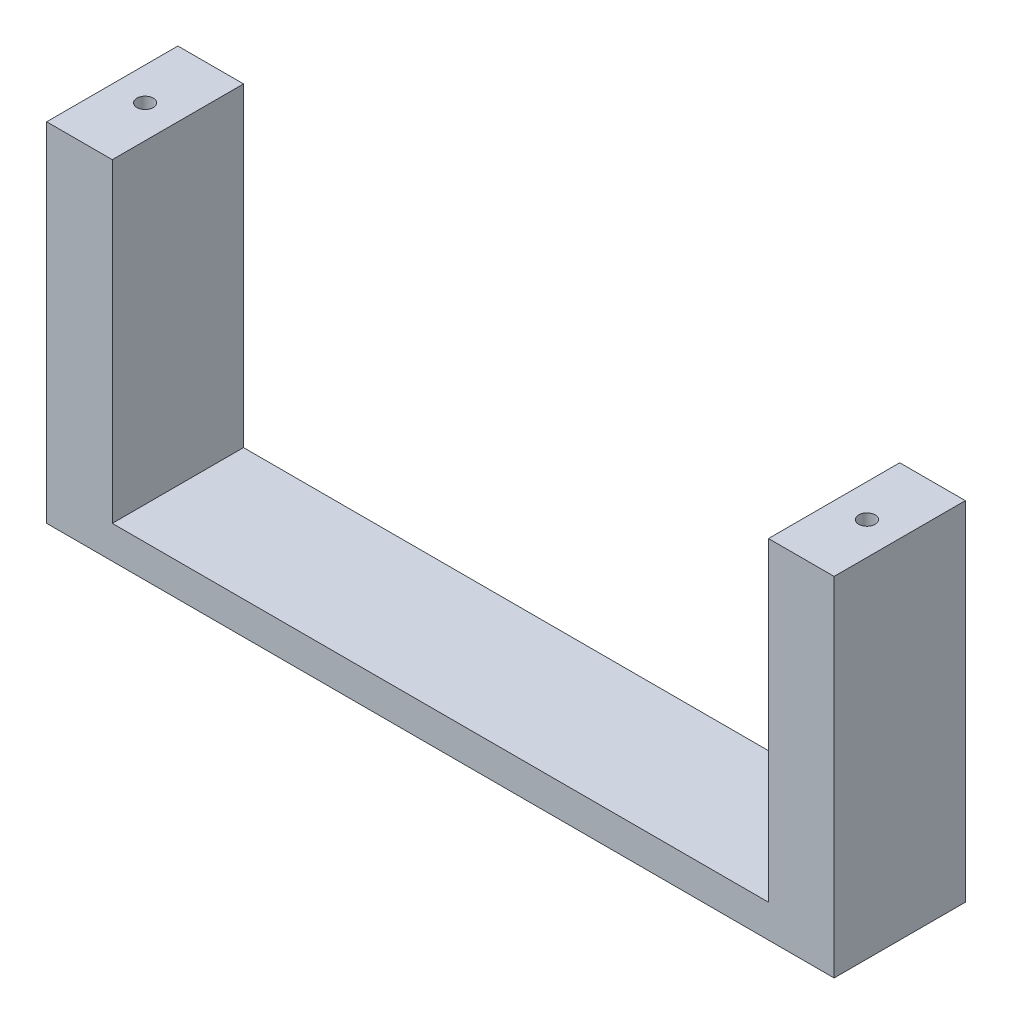
ISO-10303-21;
HEADER;
FILE_DESCRIPTION(('STEP AP214'),'2;1');
FILE_NAME('part.step','',(''),(''),'','','');
FILE_SCHEMA(('AUTOMOTIVE_DESIGN { 1 0 10303 214 1 1 1 1 }'));
ENDSEC;
DATA;
#1=APPLICATION_CONTEXT('core data for automotive mechanical design processes');
#2=APPLICATION_PROTOCOL_DEFINITION('international standard','automotive_design',2000,#1);
#3=PRODUCT_CONTEXT('',#1,'mechanical');
#4=PRODUCT('Part','Part','',(#3));
#5=PRODUCT_RELATED_PRODUCT_CATEGORY('part','',(#4));
#6=PRODUCT_DEFINITION_FORMATION('','',#4);
#7=PRODUCT_DEFINITION_CONTEXT('part definition',#1,'design');
#8=PRODUCT_DEFINITION('design','',#6,#7);
#9=PRODUCT_DEFINITION_SHAPE('','',#8);
#10=(LENGTH_UNIT() NAMED_UNIT(*) SI_UNIT(.MILLI.,.METRE.));
#11=(NAMED_UNIT(*) PLANE_ANGLE_UNIT() SI_UNIT($,.RADIAN.));
#12=(NAMED_UNIT(*) SI_UNIT($,.STERADIAN.) SOLID_ANGLE_UNIT());
#13=UNCERTAINTY_MEASURE_WITH_UNIT(LENGTH_MEASURE(1.E-05),#10,'distance_accuracy_value','');
#14=(GEOMETRIC_REPRESENTATION_CONTEXT(3) GLOBAL_UNCERTAINTY_ASSIGNED_CONTEXT((#13)) GLOBAL_UNIT_ASSIGNED_CONTEXT((#10,
#11,#12)) REPRESENTATION_CONTEXT('',''));
#15=CARTESIAN_POINT('',(0.,0.,0.));
#16=DIRECTION('',(0.,0.,1.));
#17=DIRECTION('',(1.,0.,0.));
#18=AXIS2_PLACEMENT_3D('',#15,#16,#17);
#19=CARTESIAN_POINT('',(0.,5.,0.));
#20=DIRECTION('',(0.,1.,0.));
#21=DIRECTION('',(0.,0.,1.));
#22=AXIS2_PLACEMENT_3D('',#19,#20,#21);
#23=PLANE('',#22);
#24=DIRECTION('',(-1.,0.,0.));
#25=VECTOR('',#24,1.);
#26=CARTESIAN_POINT('',(60.,5.,-10.));
#27=LINE('',#26,#25);
#28=CARTESIAN_POINT('',(50.,5.,-10.));
#29=VERTEX_POINT('',#28);
#30=CARTESIAN_POINT('',(-50.,5.,-9.99999999999999));
#31=VERTEX_POINT('',#30);
#32=EDGE_CURVE('E59',#29,#31,#27,.T.);
#33=ORIENTED_EDGE('',*,*,#32,.T.);
#34=DIRECTION('',(0.,0.,-1.));
#35=VECTOR('',#34,1.);
#36=CARTESIAN_POINT('',(-50.,5.,-9.99999999999999));
#37=LINE('',#36,#35);
#38=CARTESIAN_POINT('',(-50.,5.,10.));
#39=VERTEX_POINT('',#38);
#40=EDGE_CURVE('E54',#39,#31,#37,.T.);
#41=ORIENTED_EDGE('',*,*,#40,.F.);
#42=DIRECTION('',(1.,0.,0.));
#43=VECTOR('',#42,1.);
#44=CARTESIAN_POINT('',(60.,5.,9.99999999999999));
#45=LINE('',#44,#43);
#46=CARTESIAN_POINT('',(50.,5.,10.));
#47=VERTEX_POINT('',#46);
#48=EDGE_CURVE('E168',#39,#47,#45,.T.);
#49=ORIENTED_EDGE('',*,*,#48,.T.);
#50=DIRECTION('',(0.,0.,1.));
#51=VECTOR('',#50,1.);
#52=CARTESIAN_POINT('',(50.,5.,-10.));
#53=LINE('',#52,#51);
#54=EDGE_CURVE('E142',#29,#47,#53,.T.);
#55=ORIENTED_EDGE('',*,*,#54,.F.);
#56=EDGE_LOOP('',(#33,#41,#49,#55));
#57=FACE_BOUND('',#56,.T.);
#58=ADVANCED_FACE('F38',(#57),#23,.T.);
#59=CARTESIAN_POINT('',(-60.,5.,10.));
#60=DIRECTION('',(1.,0.,0.));
#61=DIRECTION('',(0.,0.,-1.));
#62=AXIS2_PLACEMENT_3D('',#59,#60,#61);
#63=PLANE('',#62);
#64=DIRECTION('',(0.,0.,1.));
#65=VECTOR('',#64,1.);
#66=CARTESIAN_POINT('',(-60.,0.,10.));
#67=LINE('',#66,#65);
#68=CARTESIAN_POINT('',(-60.,0.,-9.99999999999999));
#69=VERTEX_POINT('',#68);
#70=CARTESIAN_POINT('',(-60.,0.,10.));
#71=VERTEX_POINT('',#70);
#72=EDGE_CURVE('E107',#69,#71,#67,.T.);
#73=ORIENTED_EDGE('',*,*,#72,.T.);
#74=DIRECTION('',(0.,-1.,0.));
#75=VECTOR('',#74,1.);
#76=CARTESIAN_POINT('',(-60.,5.,10.));
#77=LINE('',#76,#75);
#78=CARTESIAN_POINT('',(-60.,53.,10.));
#79=VERTEX_POINT('',#78);
#80=EDGE_CURVE('E11',#79,#71,#77,.T.);
#81=ORIENTED_EDGE('',*,*,#80,.F.);
#82=DIRECTION('',(0.,0.,1.));
#83=VECTOR('',#82,1.);
#84=CARTESIAN_POINT('',(-60.,53.,-9.99999999999999));
#85=LINE('',#84,#83);
#86=CARTESIAN_POINT('',(-60.,53.,-9.99999999999999));
#87=VERTEX_POINT('',#86);
#88=EDGE_CURVE('E105',#87,#79,#85,.T.);
#89=ORIENTED_EDGE('',*,*,#88,.F.);
#90=DIRECTION('',(0.,-1.,0.));
#91=VECTOR('',#90,1.);
#92=CARTESIAN_POINT('',(-60.,5.,-9.99999999999999));
#93=LINE('',#92,#91);
#94=EDGE_CURVE('E174',#87,#69,#93,.T.);
#95=ORIENTED_EDGE('',*,*,#94,.T.);
#96=EDGE_LOOP('',(#73,#81,#89,#95));
#97=FACE_BOUND('',#96,.T.);
#98=ADVANCED_FACE('F40',(#97),#63,.F.);
#99=CARTESIAN_POINT('',(60.,5.,9.99999999999999));
#100=DIRECTION('',(0.,0.,-1.));
#101=DIRECTION('',(-1.,0.,0.));
#102=AXIS2_PLACEMENT_3D('',#99,#100,#101);
#103=PLANE('',#102);
#104=DIRECTION('',(1.,0.,0.));
#105=VECTOR('',#104,1.);
#106=CARTESIAN_POINT('',(60.,0.,9.99999999999999));
#107=LINE('',#106,#105);
#108=CARTESIAN_POINT('',(60.,0.,9.99999999999999));
#109=VERTEX_POINT('',#108);
#110=EDGE_CURVE('E177',#71,#109,#107,.T.);
#111=ORIENTED_EDGE('',*,*,#110,.T.);
#112=DIRECTION('',(0.,-1.,0.));
#113=VECTOR('',#112,1.);
#114=CARTESIAN_POINT('',(60.,5.,9.99999999999999));
#115=LINE('',#114,#113);
#116=CARTESIAN_POINT('',(60.,53.,10.));
#117=VERTEX_POINT('',#116);
#118=EDGE_CURVE('E47',#117,#109,#115,.T.);
#119=ORIENTED_EDGE('',*,*,#118,.F.);
#120=DIRECTION('',(1.,0.,0.));
#121=VECTOR('',#120,1.);
#122=CARTESIAN_POINT('',(60.,53.,10.));
#123=LINE('',#122,#121);
#124=CARTESIAN_POINT('',(50.,53.,10.));
#125=VERTEX_POINT('',#124);
#126=EDGE_CURVE('E153',#125,#117,#123,.T.);
#127=ORIENTED_EDGE('',*,*,#126,.F.);
#128=DIRECTION('',(0.,-1.,0.));
#129=VECTOR('',#128,1.);
#130=CARTESIAN_POINT('',(50.,53.,10.));
#131=LINE('',#130,#129);
#132=EDGE_CURVE('E157',#125,#47,#131,.T.);
#133=ORIENTED_EDGE('',*,*,#132,.T.);
#134=ORIENTED_EDGE('',*,*,#48,.F.);
#135=DIRECTION('',(0.,-1.,0.));
#136=VECTOR('',#135,1.);
#137=CARTESIAN_POINT('',(-50.,53.,10.));
#138=LINE('',#137,#136);
#139=CARTESIAN_POINT('',(-50.,53.,10.));
#140=VERTEX_POINT('',#139);
#141=EDGE_CURVE('E113',#140,#39,#138,.T.);
#142=ORIENTED_EDGE('',*,*,#141,.F.);
#143=DIRECTION('',(1.,0.,0.));
#144=VECTOR('',#143,1.);
#145=CARTESIAN_POINT('',(-60.,53.,10.));
#146=LINE('',#145,#144);
#147=EDGE_CURVE('E110',#79,#140,#146,.T.);
#148=ORIENTED_EDGE('',*,*,#147,.F.);
#149=ORIENTED_EDGE('',*,*,#80,.T.);
#150=EDGE_LOOP('',(#111,#119,#127,#133,#134,#142,#148,#149));
#151=FACE_BOUND('',#150,.T.);
#152=ADVANCED_FACE('F111',(#151),#103,.F.);
#153=CARTESIAN_POINT('',(60.,5.,9.99999999999999));
#154=DIRECTION('',(-1.,0.,0.));
#155=DIRECTION('',(0.,0.,1.));
#156=AXIS2_PLACEMENT_3D('',#153,#154,#155);
#157=PLANE('',#156);
#158=DIRECTION('',(0.,0.,-1.));
#159=VECTOR('',#158,1.);
#160=CARTESIAN_POINT('',(60.,0.,9.99999999999999));
#161=LINE('',#160,#159);
#162=CARTESIAN_POINT('',(60.,0.,-10.));
#163=VERTEX_POINT('',#162);
#164=EDGE_CURVE('E180',#109,#163,#161,.T.);
#165=ORIENTED_EDGE('',*,*,#164,.T.);
#166=DIRECTION('',(0.,-1.,0.));
#167=VECTOR('',#166,1.);
#168=CARTESIAN_POINT('',(60.,5.,-10.));
#169=LINE('',#168,#167);
#170=CARTESIAN_POINT('',(60.,53.,-10.));
#171=VERTEX_POINT('',#170);
#172=EDGE_CURVE('E187',#171,#163,#169,.T.);
#173=ORIENTED_EDGE('',*,*,#172,.F.);
#174=DIRECTION('',(0.,0.,-1.));
#175=VECTOR('',#174,1.);
#176=CARTESIAN_POINT('',(60.,53.,-10.));
#177=LINE('',#176,#175);
#178=EDGE_CURVE('E143',#117,#171,#177,.T.);
#179=ORIENTED_EDGE('',*,*,#178,.F.);
#180=ORIENTED_EDGE('',*,*,#118,.T.);
#181=EDGE_LOOP('',(#165,#173,#179,#180));
#182=FACE_BOUND('',#181,.T.);
#183=ADVANCED_FACE('F195',(#182),#157,.F.);
#184=CARTESIAN_POINT('',(60.,5.,-10.));
#185=DIRECTION('',(0.,0.,1.));
#186=DIRECTION('',(1.,0.,0.));
#187=AXIS2_PLACEMENT_3D('',#184,#185,#186);
#188=PLANE('',#187);
#189=DIRECTION('',(-1.,0.,0.));
#190=VECTOR('',#189,1.);
#191=CARTESIAN_POINT('',(60.,0.,-10.));
#192=LINE('',#191,#190);
#193=EDGE_CURVE('E171',#163,#69,#192,.T.);
#194=ORIENTED_EDGE('',*,*,#193,.T.);
#195=ORIENTED_EDGE('',*,*,#94,.F.);
#196=DIRECTION('',(-1.,0.,0.));
#197=VECTOR('',#196,1.);
#198=CARTESIAN_POINT('',(-60.,53.,-9.99999999999999));
#199=LINE('',#198,#197);
#200=CARTESIAN_POINT('',(-50.,53.,-9.99999999999999));
#201=VERTEX_POINT('',#200);
#202=EDGE_CURVE('E122',#201,#87,#199,.T.);
#203=ORIENTED_EDGE('',*,*,#202,.F.);
#204=DIRECTION('',(0.,-1.,0.));
#205=VECTOR('',#204,1.);
#206=CARTESIAN_POINT('',(-50.,53.,-9.99999999999999));
#207=LINE('',#206,#205);
#208=EDGE_CURVE('E135',#201,#31,#207,.T.);
#209=ORIENTED_EDGE('',*,*,#208,.T.);
#210=ORIENTED_EDGE('',*,*,#32,.F.);
#211=DIRECTION('',(0.,-1.,0.));
#212=VECTOR('',#211,1.);
#213=CARTESIAN_POINT('',(50.,53.,-10.));
#214=LINE('',#213,#212);
#215=CARTESIAN_POINT('',(50.,53.,-10.));
#216=VERTEX_POINT('',#215);
#217=EDGE_CURVE('E164',#216,#29,#214,.T.);
#218=ORIENTED_EDGE('',*,*,#217,.F.);
#219=DIRECTION('',(-1.,0.,0.));
#220=VECTOR('',#219,1.);
#221=CARTESIAN_POINT('',(60.,53.,-10.));
#222=LINE('',#221,#220);
#223=EDGE_CURVE('E147',#171,#216,#222,.T.);
#224=ORIENTED_EDGE('',*,*,#223,.F.);
#225=ORIENTED_EDGE('',*,*,#172,.T.);
#226=EDGE_LOOP('',(#194,#195,#203,#209,#210,#218,#224,#225));
#227=FACE_BOUND('',#226,.T.);
#228=ADVANCED_FACE('F201',(#227),#188,.F.);
#229=CARTESIAN_POINT('',(0.,0.,0.));
#230=DIRECTION('',(0.,1.,0.));
#231=DIRECTION('',(0.,0.,1.));
#232=AXIS2_PLACEMENT_3D('',#229,#230,#231);
#233=PLANE('',#232);
#234=ORIENTED_EDGE('',*,*,#72,.F.);
#235=ORIENTED_EDGE('',*,*,#193,.F.);
#236=ORIENTED_EDGE('',*,*,#164,.F.);
#237=ORIENTED_EDGE('',*,*,#110,.F.);
#238=EDGE_LOOP('',(#234,#235,#236,#237));
#239=FACE_BOUND('',#238,.T.);
#240=ADVANCED_FACE('F199',(#239),#233,.F.);
#241=CARTESIAN_POINT('',(50.,53.,-10.));
#242=DIRECTION('',(1.,0.,0.));
#243=DIRECTION('',(0.,0.,-1.));
#244=AXIS2_PLACEMENT_3D('',#241,#242,#243);
#245=PLANE('',#244);
#246=ORIENTED_EDGE('',*,*,#54,.T.);
#247=ORIENTED_EDGE('',*,*,#132,.F.);
#248=DIRECTION('',(0.,0.,1.));
#249=VECTOR('',#248,1.);
#250=CARTESIAN_POINT('',(50.,53.,-10.));
#251=LINE('',#250,#249);
#252=EDGE_CURVE('E150',#216,#125,#251,.T.);
#253=ORIENTED_EDGE('',*,*,#252,.F.);
#254=ORIENTED_EDGE('',*,*,#217,.T.);
#255=EDGE_LOOP('',(#246,#247,#253,#254));
#256=FACE_BOUND('',#255,.T.);
#257=ADVANCED_FACE('F209',(#256),#245,.F.);
#258=CARTESIAN_POINT('',(0.,53.,0.));
#259=DIRECTION('',(0.,-1.,0.));
#260=DIRECTION('',(0.,0.,-1.));
#261=AXIS2_PLACEMENT_3D('',#258,#259,#260);
#262=PLANE('',#261);
#263=CARTESIAN_POINT('',(55.,53.,0.));
#264=DIRECTION('',(0.,1.,0.));
#265=DIRECTION('',(0.,0.,1.));
#266=AXIS2_PLACEMENT_3D('',#263,#264,#265);
#267=CIRCLE('',#266,1.25);
#268=CARTESIAN_POINT('',(55.,53.,1.25));
#269=VERTEX_POINT('',#268);
#270=EDGE_CURVE('E314',#269,#269,#267,.T.);
#271=ORIENTED_EDGE('',*,*,#270,.F.);
#272=EDGE_LOOP('',(#271));
#273=FACE_BOUND('',#272,.T.);
#274=ORIENTED_EDGE('',*,*,#178,.T.);
#275=ORIENTED_EDGE('',*,*,#223,.T.);
#276=ORIENTED_EDGE('',*,*,#252,.T.);
#277=ORIENTED_EDGE('',*,*,#126,.T.);
#278=EDGE_LOOP('',(#274,#275,#276,#277));
#279=FACE_BOUND('',#278,.T.);
#280=ADVANCED_FACE('F206',(#273,#279),#262,.F.);
#281=CARTESIAN_POINT('',(-50.,53.,-9.99999999999999));
#282=DIRECTION('',(-1.,0.,0.));
#283=DIRECTION('',(0.,0.,1.));
#284=AXIS2_PLACEMENT_3D('',#281,#282,#283);
#285=PLANE('',#284);
#286=ORIENTED_EDGE('',*,*,#40,.T.);
#287=ORIENTED_EDGE('',*,*,#208,.F.);
#288=DIRECTION('',(0.,0.,-1.));
#289=VECTOR('',#288,1.);
#290=CARTESIAN_POINT('',(-50.,53.,-9.99999999999999));
#291=LINE('',#290,#289);
#292=EDGE_CURVE('E117',#140,#201,#291,.T.);
#293=ORIENTED_EDGE('',*,*,#292,.F.);
#294=ORIENTED_EDGE('',*,*,#141,.T.);
#295=EDGE_LOOP('',(#286,#287,#293,#294));
#296=FACE_BOUND('',#295,.T.);
#297=ADVANCED_FACE('F212',(#296),#285,.F.);
#298=CARTESIAN_POINT('',(0.,53.,0.));
#299=DIRECTION('',(0.,1.,0.));
#300=DIRECTION('',(0.,0.,1.));
#301=AXIS2_PLACEMENT_3D('',#298,#299,#300);
#302=PLANE('',#301);
#303=CARTESIAN_POINT('',(-55.,53.,0.));
#304=DIRECTION('',(0.,1.,0.));
#305=DIRECTION('',(0.,0.,1.));
#306=AXIS2_PLACEMENT_3D('',#303,#304,#305);
#307=CIRCLE('',#306,1.25);
#308=CARTESIAN_POINT('',(-55.,53.,1.25));
#309=VERTEX_POINT('',#308);
#310=EDGE_CURVE('E129',#309,#309,#307,.T.);
#311=ORIENTED_EDGE('',*,*,#310,.F.);
#312=EDGE_LOOP('',(#311));
#313=FACE_BOUND('',#312,.T.);
#314=ORIENTED_EDGE('',*,*,#88,.T.);
#315=ORIENTED_EDGE('',*,*,#147,.T.);
#316=ORIENTED_EDGE('',*,*,#292,.T.);
#317=ORIENTED_EDGE('',*,*,#202,.T.);
#318=EDGE_LOOP('',(#314,#315,#316,#317));
#319=FACE_BOUND('',#318,.T.);
#320=ADVANCED_FACE('F120',(#313,#319),#302,.T.);
#321=CARTESIAN_POINT('',(-55.,43.,0.));
#322=DIRECTION('',(0.,1.,0.));
#323=DIRECTION('',(0.,0.,1.));
#324=AXIS2_PLACEMENT_3D('',#321,#322,#323);
#325=CYLINDRICAL_SURFACE('',#324,1.25);
#326=CARTESIAN_POINT('',(-55.,43.,0.));
#327=DIRECTION('',(0.,1.,0.));
#328=DIRECTION('',(0.,0.,1.));
#329=AXIS2_PLACEMENT_3D('',#326,#327,#328);
#330=CIRCLE('',#329,1.25);
#331=CARTESIAN_POINT('',(-55.,43.,1.25));
#332=VERTEX_POINT('',#331);
#333=EDGE_CURVE('E318',#332,#332,#330,.T.);
#334=ORIENTED_EDGE('',*,*,#333,.F.);
#335=EDGE_LOOP('',(#334));
#336=FACE_BOUND('',#335,.T.);
#337=ORIENTED_EDGE('',*,*,#310,.T.);
#338=EDGE_LOOP('',(#337));
#339=FACE_BOUND('',#338,.T.);
#340=ADVANCED_FACE('F220',(#336,#339),#325,.F.);
#341=CARTESIAN_POINT('',(-55.,43.,0.));
#342=DIRECTION('',(0.,1.,0.));
#343=DIRECTION('',(0.,0.,1.));
#344=AXIS2_PLACEMENT_3D('',#341,#342,#343);
#345=PLANE('',#344);
#346=ORIENTED_EDGE('',*,*,#333,.T.);
#347=EDGE_LOOP('',(#346));
#348=FACE_BOUND('',#347,.T.);
#349=ADVANCED_FACE('F277',(#348),#345,.T.);
#350=CARTESIAN_POINT('',(55.,43.,0.));
#351=DIRECTION('',(0.,1.,0.));
#352=DIRECTION('',(0.,0.,1.));
#353=AXIS2_PLACEMENT_3D('',#350,#351,#352);
#354=CYLINDRICAL_SURFACE('',#353,1.25);
#355=CARTESIAN_POINT('',(55.,43.,0.));
#356=DIRECTION('',(0.,1.,0.));
#357=DIRECTION('',(0.,0.,1.));
#358=AXIS2_PLACEMENT_3D('',#355,#356,#357);
#359=CIRCLE('',#358,1.25);
#360=CARTESIAN_POINT('',(55.,43.,1.25));
#361=VERTEX_POINT('',#360);
#362=EDGE_CURVE('E126',#361,#361,#359,.T.);
#363=ORIENTED_EDGE('',*,*,#362,.F.);
#364=EDGE_LOOP('',(#363));
#365=FACE_BOUND('',#364,.T.);
#366=ORIENTED_EDGE('',*,*,#270,.T.);
#367=EDGE_LOOP('',(#366));
#368=FACE_BOUND('',#367,.T.);
#369=ADVANCED_FACE('F287',(#365,#368),#354,.F.);
#370=CARTESIAN_POINT('',(55.,43.,0.));
#371=DIRECTION('',(0.,1.,0.));
#372=DIRECTION('',(0.,0.,1.));
#373=AXIS2_PLACEMENT_3D('',#370,#371,#372);
#374=PLANE('',#373);
#375=ORIENTED_EDGE('',*,*,#362,.T.);
#376=EDGE_LOOP('',(#375));
#377=FACE_BOUND('',#376,.T.);
#378=ADVANCED_FACE('F297',(#377),#374,.T.);
#379=CLOSED_SHELL('',(#58,#98,#152,#183,#228,#240,#257,#280,#297,#320,#340,#349,#369,#378));
#380=MANIFOLD_SOLID_BREP('B2',#379);
#381=ADVANCED_BREP_SHAPE_REPRESENTATION('',(#18,#380),#14);
#382=SHAPE_DEFINITION_REPRESENTATION(#9,#381);
ENDSEC;
END-ISO-10303-21;
